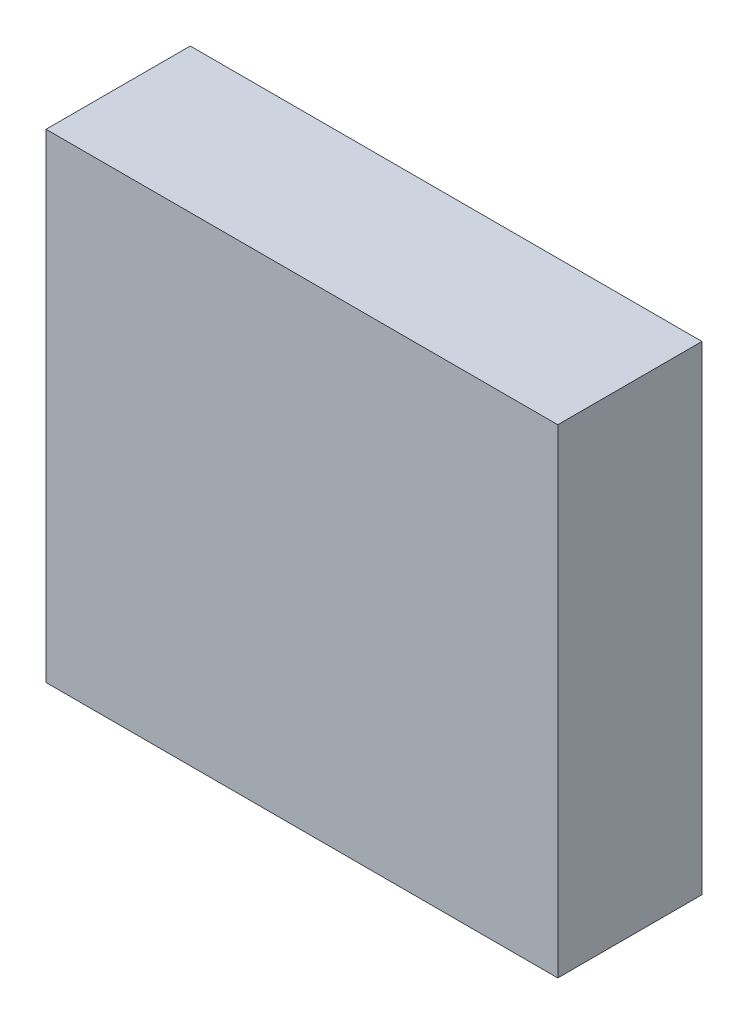
ISO-10303-21;
HEADER;
FILE_DESCRIPTION(('STEP AP214'),'2;1');
FILE_NAME('part.step','',(''),(''),'','','');
FILE_SCHEMA(('AUTOMOTIVE_DESIGN { 1 0 10303 214 1 1 1 1 }'));
ENDSEC;
DATA;
#1=APPLICATION_CONTEXT('core data for automotive mechanical design processes');
#2=APPLICATION_PROTOCOL_DEFINITION('international standard','automotive_design',2000,#1);
#3=PRODUCT_CONTEXT('',#1,'mechanical');
#4=PRODUCT('Part','Part','',(#3));
#5=PRODUCT_RELATED_PRODUCT_CATEGORY('part','',(#4));
#6=PRODUCT_DEFINITION_FORMATION('','',#4);
#7=PRODUCT_DEFINITION_CONTEXT('part definition',#1,'design');
#8=PRODUCT_DEFINITION('design','',#6,#7);
#9=PRODUCT_DEFINITION_SHAPE('','',#8);
#10=(LENGTH_UNIT() NAMED_UNIT(*) SI_UNIT(.MILLI.,.METRE.));
#11=(NAMED_UNIT(*) PLANE_ANGLE_UNIT() SI_UNIT($,.RADIAN.));
#12=(NAMED_UNIT(*) SI_UNIT($,.STERADIAN.) SOLID_ANGLE_UNIT());
#13=UNCERTAINTY_MEASURE_WITH_UNIT(LENGTH_MEASURE(1.E-05),#10,'distance_accuracy_value','');
#14=(GEOMETRIC_REPRESENTATION_CONTEXT(3) GLOBAL_UNCERTAINTY_ASSIGNED_CONTEXT((#13)) GLOBAL_UNIT_ASSIGNED_CONTEXT((#10,
#11,#12)) REPRESENTATION_CONTEXT('',''));
#15=CARTESIAN_POINT('',(0.,0.,0.));
#16=DIRECTION('',(0.,0.,1.));
#17=DIRECTION('',(1.,0.,0.));
#18=AXIS2_PLACEMENT_3D('',#15,#16,#17);
#19=CARTESIAN_POINT('',(-4.94999772,-5.14999986,1.39999974));
#20=DIRECTION('',(-1.,0.,0.));
#21=DIRECTION('',(0.,1.,0.));
#22=AXIS2_PLACEMENT_3D('',#19,#20,#21);
#23=PLANE('',#22);
#24=DIRECTION('',(0.,0.,1.));
#25=VECTOR('',#24,1.);
#26=CARTESIAN_POINT('',(-4.94999772,-5.14999986,1.39999974));
#27=LINE('',#26,#25);
#28=CARTESIAN_POINT('',(-4.94999772,-5.14999986,1.39999974));
#29=VERTEX_POINT('',#28);
#30=CARTESIAN_POINT('',(-4.94999772,-5.14999986,4.50000116));
#31=VERTEX_POINT('',#30);
#32=EDGE_CURVE('E10',#29,#31,#27,.T.);
#33=ORIENTED_EDGE('',*,*,#32,.T.);
#34=DIRECTION('',(0.,1.,0.));
#35=VECTOR('',#34,1.);
#36=CARTESIAN_POINT('',(-4.94999772,-5.14999986,4.50000116));
#37=LINE('',#36,#35);
#38=CARTESIAN_POINT('',(-4.94999772,5.14999986,4.50000116));
#39=VERTEX_POINT('',#38);
#40=EDGE_CURVE('E23',#31,#39,#37,.T.);
#41=ORIENTED_EDGE('',*,*,#40,.T.);
#42=DIRECTION('',(0.,0.,1.));
#43=VECTOR('',#42,1.);
#44=CARTESIAN_POINT('',(-4.94999772,5.14999986,1.39999974));
#45=LINE('',#44,#43);
#46=CARTESIAN_POINT('',(-4.94999772,5.14999986,1.39999974));
#47=VERTEX_POINT('',#46);
#48=EDGE_CURVE('E83',#47,#39,#45,.T.);
#49=ORIENTED_EDGE('',*,*,#48,.F.);
#50=DIRECTION('',(0.,1.,0.));
#51=VECTOR('',#50,1.);
#52=CARTESIAN_POINT('',(-4.94999772,-5.14999986,1.39999974));
#53=LINE('',#52,#51);
#54=EDGE_CURVE('E81',#29,#47,#53,.T.);
#55=ORIENTED_EDGE('',*,*,#54,.F.);
#56=EDGE_LOOP('',(#33,#41,#49,#55));
#57=FACE_BOUND('',#56,.T.);
#58=ADVANCED_FACE('F16',(#57),#23,.T.);
#59=CARTESIAN_POINT('',(-4.94999772,5.14999986,1.39999974));
#60=DIRECTION('',(0.,1.,0.));
#61=DIRECTION('',(1.,0.,0.));
#62=AXIS2_PLACEMENT_3D('',#59,#60,#61);
#63=PLANE('',#62);
#64=ORIENTED_EDGE('',*,*,#48,.T.);
#65=DIRECTION('',(1.,0.,0.));
#66=VECTOR('',#65,1.);
#67=CARTESIAN_POINT('',(-4.94999772,5.14999986,4.50000116));
#68=LINE('',#67,#66);
#69=CARTESIAN_POINT('',(6.0500006,5.14999986,4.50000116));
#70=VERTEX_POINT('',#69);
#71=EDGE_CURVE('E78',#39,#70,#68,.T.);
#72=ORIENTED_EDGE('',*,*,#71,.T.);
#73=DIRECTION('',(0.,0.,1.));
#74=VECTOR('',#73,1.);
#75=CARTESIAN_POINT('',(6.0500006,5.14999986,1.39999974));
#76=LINE('',#75,#74);
#77=CARTESIAN_POINT('',(6.0500006,5.14999986,1.39999974));
#78=VERTEX_POINT('',#77);
#79=EDGE_CURVE('E76',#78,#70,#76,.T.);
#80=ORIENTED_EDGE('',*,*,#79,.F.);
#81=DIRECTION('',(1.,0.,0.));
#82=VECTOR('',#81,1.);
#83=CARTESIAN_POINT('',(-4.94999772,5.14999986,1.39999974));
#84=LINE('',#83,#82);
#85=EDGE_CURVE('E67',#47,#78,#84,.T.);
#86=ORIENTED_EDGE('',*,*,#85,.F.);
#87=EDGE_LOOP('',(#64,#72,#80,#86));
#88=FACE_BOUND('',#87,.T.);
#89=ADVANCED_FACE('F89',(#88),#63,.T.);
#90=CARTESIAN_POINT('',(6.0500006,5.14999986,1.39999974));
#91=DIRECTION('',(1.,0.,0.));
#92=DIRECTION('',(0.,-1.,0.));
#93=AXIS2_PLACEMENT_3D('',#90,#91,#92);
#94=PLANE('',#93);
#95=ORIENTED_EDGE('',*,*,#79,.T.);
#96=DIRECTION('',(0.,-1.,0.));
#97=VECTOR('',#96,1.);
#98=CARTESIAN_POINT('',(6.0500006,5.14999986,4.50000116));
#99=LINE('',#98,#97);
#100=CARTESIAN_POINT('',(6.0500006,-5.14999986,4.50000116));
#101=VERTEX_POINT('',#100);
#102=EDGE_CURVE('E59',#70,#101,#99,.T.);
#103=ORIENTED_EDGE('',*,*,#102,.T.);
#104=DIRECTION('',(0.,0.,1.));
#105=VECTOR('',#104,1.);
#106=CARTESIAN_POINT('',(6.0500006,-5.14999986,1.39999974));
#107=LINE('',#106,#105);
#108=CARTESIAN_POINT('',(6.0500006,-5.14999986,1.39999974));
#109=VERTEX_POINT('',#108);
#110=EDGE_CURVE('E53',#109,#101,#107,.T.);
#111=ORIENTED_EDGE('',*,*,#110,.F.);
#112=DIRECTION('',(0.,-1.,0.));
#113=VECTOR('',#112,1.);
#114=CARTESIAN_POINT('',(6.0500006,5.14999986,1.39999974));
#115=LINE('',#114,#113);
#116=EDGE_CURVE('E57',#78,#109,#115,.T.);
#117=ORIENTED_EDGE('',*,*,#116,.F.);
#118=EDGE_LOOP('',(#95,#103,#111,#117));
#119=FACE_BOUND('',#118,.T.);
#120=ADVANCED_FACE('F56',(#119),#94,.T.);
#121=CARTESIAN_POINT('',(6.0500006,-5.14999986,1.39999974));
#122=DIRECTION('',(0.,-1.,0.));
#123=DIRECTION('',(-1.,0.,0.));
#124=AXIS2_PLACEMENT_3D('',#121,#122,#123);
#125=PLANE('',#124);
#126=ORIENTED_EDGE('',*,*,#110,.T.);
#127=DIRECTION('',(-1.,0.,0.));
#128=VECTOR('',#127,1.);
#129=CARTESIAN_POINT('',(6.0500006,-5.14999986,4.50000116));
#130=LINE('',#129,#128);
#131=EDGE_CURVE('E68',#101,#31,#130,.T.);
#132=ORIENTED_EDGE('',*,*,#131,.T.);
#133=ORIENTED_EDGE('',*,*,#32,.F.);
#134=DIRECTION('',(-1.,0.,0.));
#135=VECTOR('',#134,1.);
#136=CARTESIAN_POINT('',(6.0500006,-5.14999986,1.39999974));
#137=LINE('',#136,#135);
#138=EDGE_CURVE('E66',#109,#29,#137,.T.);
#139=ORIENTED_EDGE('',*,*,#138,.F.);
#140=EDGE_LOOP('',(#126,#132,#133,#139));
#141=FACE_BOUND('',#140,.T.);
#142=ADVANCED_FACE('F70',(#141),#125,.T.);
#143=CARTESIAN_POINT('',(0.550001440000057,0.,1.39999974));
#144=DIRECTION('',(0.,0.,-1.));
#145=DIRECTION('',(0.,-1.,0.));
#146=AXIS2_PLACEMENT_3D('',#143,#144,#145);
#147=PLANE('',#146);
#148=ORIENTED_EDGE('',*,*,#54,.T.);
#149=ORIENTED_EDGE('',*,*,#85,.T.);
#150=ORIENTED_EDGE('',*,*,#116,.T.);
#151=ORIENTED_EDGE('',*,*,#138,.T.);
#152=EDGE_LOOP('',(#148,#149,#150,#151));
#153=FACE_BOUND('',#152,.T.);
#154=ADVANCED_FACE('F65',(#153),#147,.T.);
#155=CARTESIAN_POINT('',(0.550001440000057,0.,4.50000116));
#156=DIRECTION('',(0.,0.,-1.));
#157=DIRECTION('',(0.,-1.,0.));
#158=AXIS2_PLACEMENT_3D('',#155,#156,#157);
#159=PLANE('',#158);
#160=ORIENTED_EDGE('',*,*,#131,.F.);
#161=ORIENTED_EDGE('',*,*,#102,.F.);
#162=ORIENTED_EDGE('',*,*,#71,.F.);
#163=ORIENTED_EDGE('',*,*,#40,.F.);
#164=EDGE_LOOP('',(#160,#161,#162,#163));
#165=FACE_BOUND('',#164,.T.);
#166=ADVANCED_FACE('F90',(#165),#159,.F.);
#167=CLOSED_SHELL('',(#58,#89,#120,#142,#154,#166));
#168=MANIFOLD_SOLID_BREP('B1',#167);
#169=ADVANCED_BREP_SHAPE_REPRESENTATION('',(#18,#168),#14);
#170=SHAPE_DEFINITION_REPRESENTATION(#9,#169);
ENDSEC;
END-ISO-10303-21;
